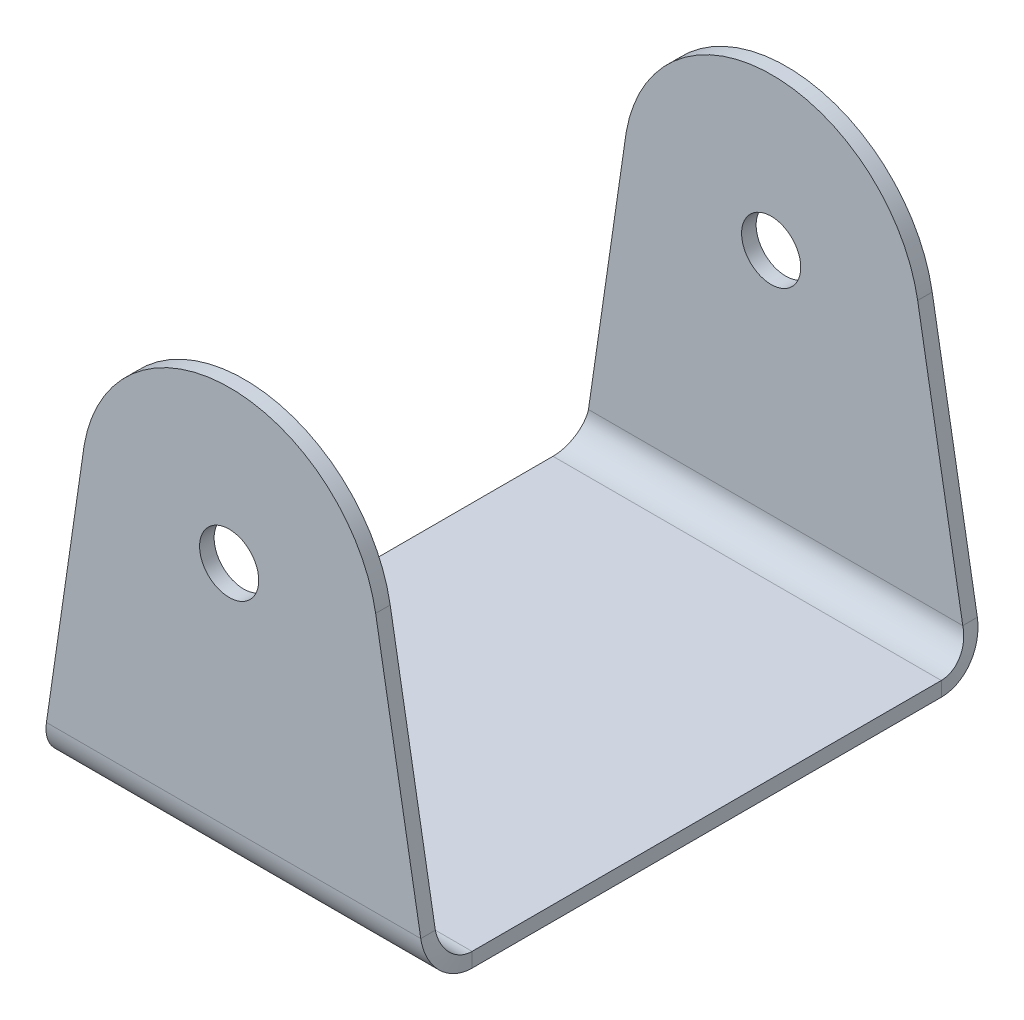
ISO-10303-21;
HEADER;
FILE_DESCRIPTION(('STEP AP214'),'2;1');
FILE_NAME('part.step','',(''),(''),'','','');
FILE_SCHEMA(('AUTOMOTIVE_DESIGN { 1 0 10303 214 1 1 1 1 }'));
ENDSEC;
DATA;
#1=APPLICATION_CONTEXT('core data for automotive mechanical design processes');
#2=APPLICATION_PROTOCOL_DEFINITION('international standard','automotive_design',2000,#1);
#3=PRODUCT_CONTEXT('',#1,'mechanical');
#4=PRODUCT('Part','Part','',(#3));
#5=PRODUCT_RELATED_PRODUCT_CATEGORY('part','',(#4));
#6=PRODUCT_DEFINITION_FORMATION('','',#4);
#7=PRODUCT_DEFINITION_CONTEXT('part definition',#1,'design');
#8=PRODUCT_DEFINITION('design','',#6,#7);
#9=PRODUCT_DEFINITION_SHAPE('','',#8);
#10=(LENGTH_UNIT() NAMED_UNIT(*) SI_UNIT(.MILLI.,.METRE.));
#11=(NAMED_UNIT(*) PLANE_ANGLE_UNIT() SI_UNIT($,.RADIAN.));
#12=(NAMED_UNIT(*) SI_UNIT($,.STERADIAN.) SOLID_ANGLE_UNIT());
#13=UNCERTAINTY_MEASURE_WITH_UNIT(LENGTH_MEASURE(1.E-05),#10,'distance_accuracy_value','');
#14=(GEOMETRIC_REPRESENTATION_CONTEXT(3) GLOBAL_UNCERTAINTY_ASSIGNED_CONTEXT((#13)) GLOBAL_UNIT_ASSIGNED_CONTEXT((#10,
#11,#12)) REPRESENTATION_CONTEXT('',''));
#15=CARTESIAN_POINT('',(0.,0.,0.));
#16=DIRECTION('',(0.,0.,1.));
#17=DIRECTION('',(1.,0.,0.));
#18=AXIS2_PLACEMENT_3D('',#15,#16,#17);
#19=CARTESIAN_POINT('',(-5.58999630794941,-5.51631765649433,43.961050169087));
#20=DIRECTION('',(1.,0.,0.));
#21=DIRECTION('',(0.,0.,-1.));
#22=AXIS2_PLACEMENT_3D('',#19,#20,#21);
#23=PLANE('',#22);
#24=DIRECTION('',(0.,-1.,0.));
#25=VECTOR('',#24,1.);
#26=CARTESIAN_POINT('',(-5.58999630794941,-5.51631765649433,-1.83404974771298));
#27=LINE('',#26,#25);
#28=CARTESIAN_POINT('',(-5.58999630794941,-4.21631765649433,-1.83404974771298));
#29=VERTEX_POINT('',#28);
#30=CARTESIAN_POINT('',(-5.58999630794941,-5.51631765649433,-1.83404974771298));
#31=VERTEX_POINT('',#30);
#32=EDGE_CURVE('E11',#29,#31,#27,.T.);
#33=ORIENTED_EDGE('',*,*,#32,.F.);
#34=DIRECTION('',(0.,0.,1.));
#35=VECTOR('',#34,1.);
#36=CARTESIAN_POINT('',(-5.58999630794941,-4.21631765649433,43.961050169087));
#37=LINE('',#36,#35);
#38=CARTESIAN_POINT('',(-5.58999630794941,-4.21631765649433,40.061050085887));
#39=VERTEX_POINT('',#38);
#40=EDGE_CURVE('E98',#39,#29,#37,.F.);
#41=ORIENTED_EDGE('',*,*,#40,.F.);
#42=DIRECTION('',(0.,-1.,0.));
#43=VECTOR('',#42,1.);
#44=CARTESIAN_POINT('',(-5.58999630794941,-5.51631765649433,40.061050085887));
#45=LINE('',#44,#43);
#46=CARTESIAN_POINT('',(-5.58999630794941,-5.51631765649433,40.061050085887));
#47=VERTEX_POINT('',#46);
#48=EDGE_CURVE('E51',#39,#47,#45,.T.);
#49=ORIENTED_EDGE('',*,*,#48,.T.);
#50=DIRECTION('',(0.,0.,-1.));
#51=VECTOR('',#50,1.);
#52=CARTESIAN_POINT('',(-5.58999630794941,-5.51631765649433,43.961050169087));
#53=LINE('',#52,#51);
#54=EDGE_CURVE('E100',#47,#31,#53,.T.);
#55=ORIENTED_EDGE('',*,*,#54,.T.);
#56=EDGE_LOOP('',(#33,#41,#49,#55));
#57=FACE_BOUND('',#56,.T.);
#58=ADVANCED_FACE('F41',(#57),#23,.T.);
#59=CARTESIAN_POINT('',(-6.94865199387656,0.983682509905666,40.061050085887));
#60=CARTESIAN_POINT('',(-6.94865199387656,1.417015843239,40.061050085887));
#61=CARTESIAN_POINT('',(-6.94865199387656,1.85034917657233,40.061050085887));
#62=CARTESIAN_POINT('',(-6.94865199387656,2.28368250990567,40.061050085887));
#63=CARTESIAN_POINT('',(-6.94865199387656,0.983682509905666,34.861049919487));
#64=CARTESIAN_POINT('',(-6.94865199387657,1.417015843239,33.9943832528204));
#65=CARTESIAN_POINT('',(-6.94865199387657,1.85034917657233,33.1277165861537));
#66=CARTESIAN_POINT('',(-6.94865199387656,2.28368250990567,32.261049919487));
#67=CARTESIAN_POINT('',(-5.58999630794941,-4.21631765649433,34.861049919487));
#68=CARTESIAN_POINT('',(-5.58999630794942,-4.64965098982767,33.9943832528204));
#69=CARTESIAN_POINT('',(-5.58999630794942,-5.082984323161,33.1277165861537));
#70=CARTESIAN_POINT('',(-5.58999630794941,-5.51631765649433,32.261049919487));
#71=CARTESIAN_POINT('',(-5.58999630794941,-4.21631765649433,40.061050085887));
#72=CARTESIAN_POINT('',(-5.58999630794941,-4.64965098982767,40.061050085887));
#73=CARTESIAN_POINT('',(-5.58999630794941,-5.082984323161,40.061050085887));
#74=CARTESIAN_POINT('',(-5.58999630794941,-5.51631765649433,40.061050085887));
#75=CARTESIAN_POINT('',(-5.58999630794941,-4.21631765649433,45.261050252287));
#76=CARTESIAN_POINT('',(-5.58999630794942,-4.64965098982767,46.1277169189537));
#77=CARTESIAN_POINT('',(-5.58999630794942,-5.082984323161,46.9943835856204));
#78=CARTESIAN_POINT('',(-5.58999630794941,-5.51631765649433,47.861050252287));
#79=CARTESIAN_POINT('',(-6.94865199387656,0.983682509905666,45.261050252287));
#80=CARTESIAN_POINT('',(-6.94865199387657,1.417015843239,46.1277169189537));
#81=CARTESIAN_POINT('',(-6.94865199387657,1.85034917657233,46.9943835856204));
#82=CARTESIAN_POINT('',(-6.94865199387656,2.28368250990567,47.861050252287));
#83=CARTESIAN_POINT('',(-6.94865199387656,0.983682509905666,40.061050085887));
#84=CARTESIAN_POINT('',(-6.94865199387656,1.417015843239,40.061050085887));
#85=CARTESIAN_POINT('',(-6.94865199387656,1.85034917657233,40.061050085887));
#86=CARTESIAN_POINT('',(-6.94865199387656,2.28368250990567,40.061050085887));
#87=(BOUNDED_SURFACE() B_SPLINE_SURFACE(3,3,((#59,#60,#61,#62),(#63,#64,#65,#66),(#67,#68,#69,
#70),(#71,#72,#73,#74),(#75,#76,#77,#78),(#79,#80,#81,#82),(#83,#84,#85,#86)),.UNSPECIFIED.,.T.,
.F.,.F.) B_SPLINE_SURFACE_WITH_KNOTS((4,3,4),(4,4),(0.,0.5,1.),(0.,1.),
.UNSPECIFIED.) GEOMETRIC_REPRESENTATION_ITEM() RATIONAL_B_SPLINE_SURFACE(((1.,1.,1.,1.),
(0.333333333333333,0.333333333333333,0.333333333333333,0.333333333333333),(0.333333333333333,
0.333333333333333,0.333333333333333,0.333333333333333),(1.,1.,1.,1.),(0.333333333333333,
0.333333333333333,0.333333333333333,0.333333333333333),(0.333333333333333,0.333333333333333,
0.333333333333333,0.333333333333333),(1.,1.,1.,1.))) REPRESENTATION_ITEM('') SURFACE());
#88=CARTESIAN_POINT('',(-6.26932415091299,-1.61631757329433,40.061050085887));
#89=DIRECTION('',(-0.967520225476182,-0.25279361798613,0.));
#90=DIRECTION('',(-0.25279361798613,0.967520225476182,0.));
#91=AXIS2_PLACEMENT_3D('',#88,#89,#90);
#92=ELLIPSE('',#91,2.68728240995723,2.6000000832);
#93=CARTESIAN_POINT('',(-6.26932415091299,-1.61631757329433,42.661050169087));
#94=VERTEX_POINT('',#93);
#95=EDGE_CURVE('E140',#39,#94,#92,.T.);
#96=DIRECTION('',(0.,0.,1.));
#97=VECTOR('',#96,1.);
#98=CARTESIAN_POINT('',(-6.26932415091299,-1.61631757329433,43.961050169087));
#99=LINE('',#98,#97);
#100=CARTESIAN_POINT('',(-6.26932415091299,-1.61631757329433,43.961050169087));
#101=VERTEX_POINT('',#100);
#102=EDGE_CURVE('E170',#94,#101,#99,.T.);
#103=CARTESIAN_POINT('',(-6.26932415091299,-1.61631757329433,40.061050085887));
#104=DIRECTION('',(-0.985166222964665,-0.171602777161489,0.));
#105=DIRECTION('',(-0.171602777161489,0.985166222964665,0.));
#106=AXIS2_PLACEMENT_3D('',#103,#104,#105);
#107=ELLIPSE('',#106,3.9587228959837,3.9000000832);
#108=EDGE_CURVE('E178',#47,#101,#107,.T.);
#109=ORIENTED_EDGE('',*,*,#48,.F.);
#110=ORIENTED_EDGE('',*,*,#95,.T.);
#111=ORIENTED_EDGE('',*,*,#102,.T.);
#112=ORIENTED_EDGE('',*,*,#108,.F.);
#113=EDGE_LOOP('',(#109,#110,#111,#112));
#114=FACE_BOUND('',#113,.T.);
#115=ADVANCED_FACE('F177',(#114),#87,.T.);
#116=CARTESIAN_POINT('',(-5.58999630794941,-5.51631765649433,43.961050169087));
#117=DIRECTION('',(0.985166222964665,0.171602777161489,0.));
#118=DIRECTION('',(-0.171602777161489,0.985166222964665,0.));
#119=AXIS2_PLACEMENT_3D('',#116,#117,#118);
#120=PLANE('',#119);
#121=ORIENTED_EDGE('',*,*,#102,.F.);
#122=DIRECTION('',(-0.171602777161489,0.985166222964665,0.));
#123=VECTOR('',#122,1.);
#124=CARTESIAN_POINT('',(-5.58999630794941,-5.51631765649433,42.661050169087));
#125=LINE('',#124,#123);
#126=CARTESIAN_POINT('',(-10.2985277811944,21.5152155385759,42.661050169087));
#127=VERTEX_POINT('',#126);
#128=EDGE_CURVE('E238',#94,#127,#125,.T.);
#129=ORIENTED_EDGE('',*,*,#128,.T.);
#130=DIRECTION('',(0.,0.,1.));
#131=VECTOR('',#130,1.);
#132=CARTESIAN_POINT('',(-10.2985277811944,21.5152155385759,43.961050169087));
#133=LINE('',#132,#131);
#134=CARTESIAN_POINT('',(-10.2985277811944,21.5152155385759,43.961050169087));
#135=VERTEX_POINT('',#134);
#136=EDGE_CURVE('E167',#127,#135,#133,.T.);
#137=ORIENTED_EDGE('',*,*,#136,.T.);
#138=DIRECTION('',(-0.171602777161489,0.985166222964665,0.));
#139=VECTOR('',#138,1.);
#140=CARTESIAN_POINT('',(-5.58999630794941,-5.51631765649433,43.961050169087));
#141=LINE('',#140,#139);
#142=EDGE_CURVE('E196',#101,#135,#141,.T.);
#143=ORIENTED_EDGE('',*,*,#142,.F.);
#144=EDGE_LOOP('',(#121,#129,#137,#143));
#145=FACE_BOUND('',#144,.T.);
#146=ADVANCED_FACE('F197',(#145),#120,.T.);
#147=CARTESIAN_POINT('',(-23.3106032541117,19.2486860578269,43.961050169087));
#148=DIRECTION('',(0.,0.,1.));
#149=DIRECTION('',(1.,0.,0.));
#150=AXIS2_PLACEMENT_3D('',#147,#148,#149);
#151=CYLINDRICAL_SURFACE('',#150,13.208);
#152=ORIENTED_EDGE('',*,*,#136,.F.);
#153=CARTESIAN_POINT('',(-23.3106032541117,19.2486860578269,42.661050169087));
#154=DIRECTION('',(0.,0.,1.));
#155=DIRECTION('',(1.,0.,0.));
#156=AXIS2_PLACEMENT_3D('',#153,#154,#155);
#157=CIRCLE('',#156,13.208);
#158=CARTESIAN_POINT('',(-36.3260636869663,21.4956960090278,42.661050169087));
#159=VERTEX_POINT('',#158);
#160=EDGE_CURVE('E129',#127,#159,#157,.T.);
#161=ORIENTED_EDGE('',*,*,#160,.T.);
#162=DIRECTION('',(0.,0.,1.));
#163=VECTOR('',#162,1.);
#164=CARTESIAN_POINT('',(-36.3260636869664,21.4956960090277,43.961050169087));
#165=LINE('',#164,#163);
#166=CARTESIAN_POINT('',(-36.3260636869664,21.4956960090277,43.961050169087));
#167=VERTEX_POINT('',#166);
#168=EDGE_CURVE('E164',#159,#167,#165,.T.);
#169=ORIENTED_EDGE('',*,*,#168,.T.);
#170=CARTESIAN_POINT('',(-23.3106032541117,19.2486860578269,43.961050169087));
#171=DIRECTION('',(0.,0.,1.));
#172=DIRECTION('',(1.,0.,0.));
#173=AXIS2_PLACEMENT_3D('',#170,#171,#172);
#174=CIRCLE('',#173,13.208);
#175=EDGE_CURVE('E201',#135,#167,#174,.T.);
#176=ORIENTED_EDGE('',*,*,#175,.F.);
#177=EDGE_LOOP('',(#152,#161,#169,#176));
#178=FACE_BOUND('',#177,.T.);
#179=ADVANCED_FACE('F249',(#178),#151,.T.);
#180=CARTESIAN_POINT('',(-36.3260636869664,21.4956960090277,43.961050169087));
#181=DIRECTION('',(-0.989555564392376,0.144151951010336,0.));
#182=DIRECTION('',(-0.144151951010336,-0.989555564392376,0.));
#183=AXIS2_PLACEMENT_3D('',#180,#181,#182);
#184=PLANE('',#183);
#185=ORIENTED_EDGE('',*,*,#168,.F.);
#186=DIRECTION('',(-0.144151951010336,-0.989555564392376,0.));
#187=VECTOR('',#186,1.);
#188=CARTESIAN_POINT('',(-36.3260636869664,21.4956960090277,42.661050169087));
#189=LINE('',#188,#187);
#190=CARTESIAN_POINT('',(-39.6928699276193,-1.61631757329433,42.661050169087));
#191=VERTEX_POINT('',#190);
#192=EDGE_CURVE('E146',#159,#191,#189,.T.);
#193=ORIENTED_EDGE('',*,*,#192,.T.);
#194=DIRECTION('',(0.,0.,1.));
#195=VECTOR('',#194,1.);
#196=CARTESIAN_POINT('',(-39.6928699276193,-1.61631757329433,43.961050169087));
#197=LINE('',#196,#195);
#198=CARTESIAN_POINT('',(-39.6928699276193,-1.61631757329433,43.961050169087));
#199=VERTEX_POINT('',#198);
#200=EDGE_CURVE('E161',#191,#199,#197,.T.);
#201=ORIENTED_EDGE('',*,*,#200,.T.);
#202=DIRECTION('',(-0.144151951010336,-0.989555564392376,0.));
#203=VECTOR('',#202,1.);
#204=CARTESIAN_POINT('',(-36.3260636869664,21.4956960090277,43.961050169087));
#205=LINE('',#204,#203);
#206=EDGE_CURVE('E202',#167,#199,#205,.T.);
#207=ORIENTED_EDGE('',*,*,#206,.F.);
#208=EDGE_LOOP('',(#185,#193,#201,#207));
#209=FACE_BOUND('',#208,.T.);
#210=ADVANCED_FACE('F363',(#209),#184,.T.);
#211=CARTESIAN_POINT('',(-40.2609963079494,-5.51631765649433,40.061050085887));
#212=CARTESIAN_POINT('',(-40.2609963079494,-5.082984323161,40.061050085887));
#213=CARTESIAN_POINT('',(-40.2609963079494,-4.64965098982767,40.061050085887));
#214=CARTESIAN_POINT('',(-40.2609963079494,-4.21631765649433,40.061050085887));
#215=CARTESIAN_POINT('',(-40.2609963079494,-5.51631765649433,32.261049919487));
#216=CARTESIAN_POINT('',(-40.2609963079494,-5.082984323161,33.1277165861537));
#217=CARTESIAN_POINT('',(-40.2609963079494,-4.64965098982767,33.9943832528204));
#218=CARTESIAN_POINT('',(-40.2609963079494,-4.21631765649433,34.861049919487));
#219=CARTESIAN_POINT('',(-39.1247435472892,2.28368250990567,32.261049919487));
#220=CARTESIAN_POINT('',(-39.1247435472892,1.85034917657233,33.1277165861537));
#221=CARTESIAN_POINT('',(-39.1247435472892,1.417015843239,33.9943832528204));
#222=CARTESIAN_POINT('',(-39.1247435472892,0.983682509905666,34.861049919487));
#223=CARTESIAN_POINT('',(-39.1247435472892,2.28368250990567,40.061050085887));
#224=CARTESIAN_POINT('',(-39.1247435472892,1.85034917657233,40.061050085887));
#225=CARTESIAN_POINT('',(-39.1247435472892,1.417015843239,40.061050085887));
#226=CARTESIAN_POINT('',(-39.1247435472892,0.983682509905666,40.061050085887));
#227=CARTESIAN_POINT('',(-39.1247435472892,2.28368250990566,47.861050252287));
#228=CARTESIAN_POINT('',(-39.1247435472892,1.85034917657233,46.9943835856204));
#229=CARTESIAN_POINT('',(-39.1247435472892,1.417015843239,46.1277169189537));
#230=CARTESIAN_POINT('',(-39.1247435472892,0.983682509905665,45.261050252287));
#231=CARTESIAN_POINT('',(-40.2609963079494,-5.51631765649433,47.861050252287));
#232=CARTESIAN_POINT('',(-40.2609963079494,-5.082984323161,46.9943835856204));
#233=CARTESIAN_POINT('',(-40.2609963079494,-4.64965098982767,46.1277169189537));
#234=CARTESIAN_POINT('',(-40.2609963079494,-4.21631765649433,45.261050252287));
#235=CARTESIAN_POINT('',(-40.2609963079494,-5.51631765649433,40.061050085887));
#236=CARTESIAN_POINT('',(-40.2609963079494,-5.082984323161,40.061050085887));
#237=CARTESIAN_POINT('',(-40.2609963079494,-4.64965098982767,40.061050085887));
#238=CARTESIAN_POINT('',(-40.2609963079494,-4.21631765649433,40.061050085887));
#239=(BOUNDED_SURFACE() B_SPLINE_SURFACE(3,3,((#211,#212,#213,#214),(#215,#216,#217,#218),(#219,
#220,#221,#222),(#223,#224,#225,#226),(#227,#228,#229,#230),(#231,#232,#233,#234),(#235,#236,
#237,#238)),.UNSPECIFIED.,.T.,.F.,.F.) B_SPLINE_SURFACE_WITH_KNOTS((4,3,4),(4,4),(0.,0.5,1.),
(0.,1.),.UNSPECIFIED.) GEOMETRIC_REPRESENTATION_ITEM() RATIONAL_B_SPLINE_SURFACE(((1.,1.,1.,1.),
(0.333333333333333,0.333333333333333,0.333333333333333,0.333333333333333),(0.333333333333333,
0.333333333333333,0.333333333333333,0.333333333333333),(1.,1.,1.,1.),(0.333333333333333,
0.333333333333333,0.333333333333333,0.333333333333333),(0.333333333333333,0.333333333333333,
0.333333333333333,0.333333333333333),(1.,1.,1.,1.))) REPRESENTATION_ITEM('') SURFACE());
#240=CARTESIAN_POINT('',(-39.6928699276193,-1.61631757329433,40.061050085887));
#241=DIRECTION('',(-0.976948910990753,0.213473242618322,0.));
#242=DIRECTION('',(-0.213473242618322,-0.976948910990753,0.));
#243=AXIS2_PLACEMENT_3D('',#240,#241,#242);
#244=ELLIPSE('',#243,2.66134703048419,2.6000000832);
#245=CARTESIAN_POINT('',(-40.2609963079494,-4.21631765649433,40.061050085887));
#246=VERTEX_POINT('',#245);
#247=EDGE_CURVE('E135',#191,#246,#244,.F.);
#248=DIRECTION('',(0.,-1.,0.));
#249=VECTOR('',#248,1.);
#250=CARTESIAN_POINT('',(-40.2609963079494,-5.51631765649433,40.061050085887));
#251=LINE('',#250,#249);
#252=CARTESIAN_POINT('',(-40.2609963079494,-5.51631765649433,40.061050085887));
#253=VERTEX_POINT('',#252);
#254=EDGE_CURVE('E159',#246,#253,#251,.T.);
#255=CARTESIAN_POINT('',(-39.6928699276193,-1.61631757329433,40.061050085887));
#256=DIRECTION('',(-0.989555564392376,0.144151951010336,0.));
#257=DIRECTION('',(-0.144151951010336,-0.989555564392376,0.));
#258=AXIS2_PLACEMENT_3D('',#255,#256,#257);
#259=ELLIPSE('',#258,3.94116330960631,3.9000000832);
#260=EDGE_CURVE('E193',#199,#253,#259,.F.);
#261=ORIENTED_EDGE('',*,*,#200,.F.);
#262=ORIENTED_EDGE('',*,*,#247,.T.);
#263=ORIENTED_EDGE('',*,*,#254,.T.);
#264=ORIENTED_EDGE('',*,*,#260,.F.);
#265=EDGE_LOOP('',(#261,#262,#263,#264));
#266=FACE_BOUND('',#265,.T.);
#267=ADVANCED_FACE('F357',(#266),#239,.F.);
#268=CARTESIAN_POINT('',(-40.2609963079494,-5.51631765649433,43.961050169087));
#269=DIRECTION('',(1.,0.,0.));
#270=DIRECTION('',(0.,0.,-1.));
#271=AXIS2_PLACEMENT_3D('',#268,#269,#270);
#272=PLANE('',#271);
#273=ORIENTED_EDGE('',*,*,#254,.F.);
#274=DIRECTION('',(0.,0.,1.));
#275=VECTOR('',#274,1.);
#276=CARTESIAN_POINT('',(-40.2609963079494,-4.21631765649433,43.961050169087));
#277=LINE('',#276,#275);
#278=CARTESIAN_POINT('',(-40.2609963079494,-4.21631765649433,-1.83404974771298));
#279=VERTEX_POINT('',#278);
#280=EDGE_CURVE('E128',#246,#279,#277,.F.);
#281=ORIENTED_EDGE('',*,*,#280,.T.);
#282=DIRECTION('',(0.,-1.,0.));
#283=VECTOR('',#282,1.);
#284=CARTESIAN_POINT('',(-40.2609963079494,-5.51631765649433,-1.83404974771298));
#285=LINE('',#284,#283);
#286=CARTESIAN_POINT('',(-40.2609963079494,-5.51631765649433,-1.83404974771298));
#287=VERTEX_POINT('',#286);
#288=EDGE_CURVE('E156',#279,#287,#285,.T.);
#289=ORIENTED_EDGE('',*,*,#288,.T.);
#290=DIRECTION('',(0.,0.,-1.));
#291=VECTOR('',#290,1.);
#292=CARTESIAN_POINT('',(-40.2609963079494,-5.51631765649433,43.961050169087));
#293=LINE('',#292,#291);
#294=EDGE_CURVE('E253',#253,#287,#293,.T.);
#295=ORIENTED_EDGE('',*,*,#294,.F.);
#296=EDGE_LOOP('',(#273,#281,#289,#295));
#297=FACE_BOUND('',#296,.T.);
#298=ADVANCED_FACE('F348',(#297),#272,.F.);
#299=CARTESIAN_POINT('',(-39.1247435472892,0.983682509905667,-1.83404974771298));
#300=CARTESIAN_POINT('',(-39.1247435472892,1.417015843239,-1.83404974771298));
#301=CARTESIAN_POINT('',(-39.1247435472892,1.85034917657233,-1.83404974771298));
#302=CARTESIAN_POINT('',(-39.1247435472892,2.28368250990567,-1.83404974771298));
#303=CARTESIAN_POINT('',(-39.1247435472892,0.983682509905667,3.36595041868702));
#304=CARTESIAN_POINT('',(-39.1247435472892,1.417015843239,4.23261708535369));
#305=CARTESIAN_POINT('',(-39.1247435472892,1.85034917657233,5.09928375202035));
#306=CARTESIAN_POINT('',(-39.1247435472892,2.28368250990567,5.96595041868701));
#307=CARTESIAN_POINT('',(-40.2609963079494,-4.21631765649433,3.36595041868702));
#308=CARTESIAN_POINT('',(-40.2609963079494,-4.64965098982767,4.23261708535369));
#309=CARTESIAN_POINT('',(-40.2609963079494,-5.082984323161,5.09928375202035));
#310=CARTESIAN_POINT('',(-40.2609963079494,-5.51631765649433,5.96595041868702));
#311=CARTESIAN_POINT('',(-40.2609963079494,-4.21631765649433,-1.83404974771298));
#312=CARTESIAN_POINT('',(-40.2609963079494,-4.64965098982767,-1.83404974771298));
#313=CARTESIAN_POINT('',(-40.2609963079494,-5.082984323161,-1.83404974771298));
#314=CARTESIAN_POINT('',(-40.2609963079494,-5.51631765649433,-1.83404974771298));
#315=CARTESIAN_POINT('',(-40.2609963079494,-4.21631765649433,-7.03404991411298));
#316=CARTESIAN_POINT('',(-40.2609963079494,-4.64965098982767,-7.90071658077965));
#317=CARTESIAN_POINT('',(-40.2609963079494,-5.082984323161,-8.76738324744632));
#318=CARTESIAN_POINT('',(-40.2609963079494,-5.51631765649433,-9.63404991411298));
#319=CARTESIAN_POINT('',(-39.1247435472892,0.983682509905667,-7.03404991411298));
#320=CARTESIAN_POINT('',(-39.1247435472892,1.417015843239,-7.90071658077965));
#321=CARTESIAN_POINT('',(-39.1247435472892,1.85034917657233,-8.76738324744632));
#322=CARTESIAN_POINT('',(-39.1247435472892,2.28368250990567,-9.63404991411298));
#323=CARTESIAN_POINT('',(-39.1247435472892,0.983682509905667,-1.83404974771298));
#324=CARTESIAN_POINT('',(-39.1247435472892,1.417015843239,-1.83404974771298));
#325=CARTESIAN_POINT('',(-39.1247435472892,1.85034917657233,-1.83404974771298));
#326=CARTESIAN_POINT('',(-39.1247435472892,2.28368250990567,-1.83404974771298));
#327=(BOUNDED_SURFACE() B_SPLINE_SURFACE(3,3,((#299,#300,#301,#302),(#303,#304,#305,#306),(#307,
#308,#309,#310),(#311,#312,#313,#314),(#315,#316,#317,#318),(#319,#320,#321,#322),(#323,#324,
#325,#326)),.UNSPECIFIED.,.T.,.F.,.F.) B_SPLINE_SURFACE_WITH_KNOTS((4,3,4),(4,4),(0.,0.5,1.),
(0.,1.),.UNSPECIFIED.) GEOMETRIC_REPRESENTATION_ITEM() RATIONAL_B_SPLINE_SURFACE(((1.,1.,1.,1.),
(0.333333333333333,0.333333333333333,0.333333333333333,0.333333333333333),(0.333333333333333,
0.333333333333333,0.333333333333333,0.333333333333333),(1.,1.,1.,1.),(0.333333333333333,
0.333333333333333,0.333333333333333,0.333333333333333),(0.333333333333333,0.333333333333333,
0.333333333333333,0.333333333333333),(1.,1.,1.,1.))) REPRESENTATION_ITEM('') SURFACE());
#328=CARTESIAN_POINT('',(-39.6928699276193,-1.61631757329433,-1.83404974771298));
#329=DIRECTION('',(0.976948910990753,-0.213473242618322,0.));
#330=DIRECTION('',(0.213473242618322,0.976948910990753,0.));
#331=AXIS2_PLACEMENT_3D('',#328,#329,#330);
#332=ELLIPSE('',#331,2.66134703048419,2.6000000832);
#333=CARTESIAN_POINT('',(-39.6928699276193,-1.61631757329433,-4.43404983091298));
#334=VERTEX_POINT('',#333);
#335=EDGE_CURVE('E116',#279,#334,#332,.T.);
#336=DIRECTION('',(0.,0.,-1.));
#337=VECTOR('',#336,1.);
#338=CARTESIAN_POINT('',(-39.6928699276193,-1.61631757329433,-5.73404983091299));
#339=LINE('',#338,#337);
#340=CARTESIAN_POINT('',(-39.6928699276193,-1.61631757329433,-5.73404983091299));
#341=VERTEX_POINT('',#340);
#342=EDGE_CURVE('E153',#334,#341,#339,.T.);
#343=CARTESIAN_POINT('',(-39.6928699276193,-1.61631757329433,-1.83404974771298));
#344=DIRECTION('',(0.989555564392376,-0.144151951010336,0.));
#345=DIRECTION('',(0.144151951010336,0.989555564392376,0.));
#346=AXIS2_PLACEMENT_3D('',#343,#344,#345);
#347=ELLIPSE('',#346,3.94116330960631,3.9000000832);
#348=EDGE_CURVE('E215',#287,#341,#347,.T.);
#349=ORIENTED_EDGE('',*,*,#288,.F.);
#350=ORIENTED_EDGE('',*,*,#335,.T.);
#351=ORIENTED_EDGE('',*,*,#342,.T.);
#352=ORIENTED_EDGE('',*,*,#348,.F.);
#353=EDGE_LOOP('',(#349,#350,#351,#352));
#354=FACE_BOUND('',#353,.T.);
#355=ADVANCED_FACE('F342',(#354),#327,.T.);
#356=CARTESIAN_POINT('',(-36.3260636869664,21.4956960090277,-5.73404983091299));
#357=DIRECTION('',(-0.989555564392376,0.144151951010336,0.));
#358=DIRECTION('',(-0.144151951010336,-0.989555564392376,0.));
#359=AXIS2_PLACEMENT_3D('',#356,#357,#358);
#360=PLANE('',#359);
#361=ORIENTED_EDGE('',*,*,#342,.F.);
#362=DIRECTION('',(-0.144151951010336,-0.989555564392376,0.));
#363=VECTOR('',#362,1.);
#364=CARTESIAN_POINT('',(-36.3260636869664,21.4956960090277,-4.43404983091299));
#365=LINE('',#364,#363);
#366=CARTESIAN_POINT('',(-36.3260636869663,21.4956960090278,-4.43404983091299));
#367=VERTEX_POINT('',#366);
#368=EDGE_CURVE('E227',#367,#334,#365,.T.);
#369=ORIENTED_EDGE('',*,*,#368,.F.);
#370=DIRECTION('',(0.,0.,-1.));
#371=VECTOR('',#370,1.);
#372=CARTESIAN_POINT('',(-36.3260636869664,21.4956960090277,-5.73404983091299));
#373=LINE('',#372,#371);
#374=CARTESIAN_POINT('',(-36.3260636869664,21.4956960090277,-5.73404983091299));
#375=VERTEX_POINT('',#374);
#376=EDGE_CURVE('E150',#367,#375,#373,.T.);
#377=ORIENTED_EDGE('',*,*,#376,.T.);
#378=DIRECTION('',(-0.144151951010336,-0.989555564392376,0.));
#379=VECTOR('',#378,1.);
#380=CARTESIAN_POINT('',(-36.3260636869664,21.4956960090277,-5.73404983091299));
#381=LINE('',#380,#379);
#382=EDGE_CURVE('E262',#375,#341,#381,.T.);
#383=ORIENTED_EDGE('',*,*,#382,.T.);
#384=EDGE_LOOP('',(#361,#369,#377,#383));
#385=FACE_BOUND('',#384,.T.);
#386=ADVANCED_FACE('F338',(#385),#360,.T.);
#387=CARTESIAN_POINT('',(-23.3106032541117,19.2486860578269,-5.73404983091299));
#388=DIRECTION('',(0.,0.,1.));
#389=DIRECTION('',(1.,0.,0.));
#390=AXIS2_PLACEMENT_3D('',#387,#388,#389);
#391=CYLINDRICAL_SURFACE('',#390,13.208);
#392=ORIENTED_EDGE('',*,*,#376,.F.);
#393=CARTESIAN_POINT('',(-23.3106032541117,19.2486860578269,-4.43404983091299));
#394=DIRECTION('',(0.,0.,1.));
#395=DIRECTION('',(1.,0.,0.));
#396=AXIS2_PLACEMENT_3D('',#393,#394,#395);
#397=CIRCLE('',#396,13.208);
#398=CARTESIAN_POINT('',(-10.2985277811944,21.5152155385759,-4.43404983091299));
#399=VERTEX_POINT('',#398);
#400=EDGE_CURVE('E230',#399,#367,#397,.T.);
#401=ORIENTED_EDGE('',*,*,#400,.F.);
#402=DIRECTION('',(0.,0.,-1.));
#403=VECTOR('',#402,1.);
#404=CARTESIAN_POINT('',(-10.2985277811944,21.5152155385759,-5.73404983091299));
#405=LINE('',#404,#403);
#406=CARTESIAN_POINT('',(-10.2985277811944,21.5152155385759,-5.73404983091299));
#407=VERTEX_POINT('',#406);
#408=EDGE_CURVE('E147',#399,#407,#405,.T.);
#409=ORIENTED_EDGE('',*,*,#408,.T.);
#410=CARTESIAN_POINT('',(-23.3106032541117,19.2486860578269,-5.73404983091299));
#411=DIRECTION('',(0.,0.,1.));
#412=DIRECTION('',(1.,0.,0.));
#413=AXIS2_PLACEMENT_3D('',#410,#411,#412);
#414=CIRCLE('',#413,13.208);
#415=EDGE_CURVE('E265',#407,#375,#414,.T.);
#416=ORIENTED_EDGE('',*,*,#415,.T.);
#417=EDGE_LOOP('',(#392,#401,#409,#416));
#418=FACE_BOUND('',#417,.T.);
#419=ADVANCED_FACE('F334',(#418),#391,.T.);
#420=CARTESIAN_POINT('',(-5.58999630794941,-5.51631765649433,-5.73404983091299));
#421=DIRECTION('',(0.985166222964665,0.171602777161489,0.));
#422=DIRECTION('',(-0.171602777161489,0.985166222964665,0.));
#423=AXIS2_PLACEMENT_3D('',#420,#421,#422);
#424=PLANE('',#423);
#425=ORIENTED_EDGE('',*,*,#408,.F.);
#426=DIRECTION('',(-0.171602777161489,0.985166222964665,0.));
#427=VECTOR('',#426,1.);
#428=CARTESIAN_POINT('',(-5.58999630794941,-5.51631765649433,-4.43404983091299));
#429=LINE('',#428,#427);
#430=CARTESIAN_POINT('',(-6.26932415091299,-1.61631757329433,-4.43404983091299));
#431=VERTEX_POINT('',#430);
#432=EDGE_CURVE('E121',#431,#399,#429,.T.);
#433=ORIENTED_EDGE('',*,*,#432,.F.);
#434=DIRECTION('',(0.,0.,-1.));
#435=VECTOR('',#434,1.);
#436=CARTESIAN_POINT('',(-6.26932415091299,-1.61631757329433,-5.73404983091299));
#437=LINE('',#436,#435);
#438=CARTESIAN_POINT('',(-6.26932415091299,-1.61631757329433,-5.73404983091299));
#439=VERTEX_POINT('',#438);
#440=EDGE_CURVE('E45',#431,#439,#437,.T.);
#441=ORIENTED_EDGE('',*,*,#440,.T.);
#442=DIRECTION('',(-0.171602777161489,0.985166222964665,0.));
#443=VECTOR('',#442,1.);
#444=CARTESIAN_POINT('',(-5.58999630794941,-5.51631765649433,-5.73404983091299));
#445=LINE('',#444,#443);
#446=EDGE_CURVE('E268',#439,#407,#445,.T.);
#447=ORIENTED_EDGE('',*,*,#446,.T.);
#448=EDGE_LOOP('',(#425,#433,#441,#447));
#449=FACE_BOUND('',#448,.T.);
#450=ADVANCED_FACE('F325',(#449),#424,.T.);
#451=CARTESIAN_POINT('',(-23.3783250910446,18.8473943952813,43.961050169087));
#452=DIRECTION('',(0.,0.,1.));
#453=DIRECTION('',(1.,0.,0.));
#454=AXIS2_PLACEMENT_3D('',#451,#452,#453);
#455=CYLINDRICAL_SURFACE('',#454,2.6416);
#456=CARTESIAN_POINT('',(-23.3783250910446,18.8473943952813,43.961050169087));
#457=DIRECTION('',(0.,0.,1.));
#458=DIRECTION('',(1.,0.,0.));
#459=AXIS2_PLACEMENT_3D('',#456,#457,#458);
#460=CIRCLE('',#459,2.6416);
#461=CARTESIAN_POINT('',(-20.7367250910446,18.8473943952813,43.961050169087));
#462=VERTEX_POINT('',#461);
#463=EDGE_CURVE('E275',#462,#462,#460,.T.);
#464=ORIENTED_EDGE('',*,*,#463,.T.);
#465=EDGE_LOOP('',(#464));
#466=FACE_BOUND('',#465,.T.);
#467=CARTESIAN_POINT('',(-23.3783250910446,18.8473943952813,42.661050169087));
#468=DIRECTION('',(0.,0.,1.));
#469=DIRECTION('',(1.,0.,0.));
#470=AXIS2_PLACEMENT_3D('',#467,#468,#469);
#471=CIRCLE('',#470,2.6416);
#472=CARTESIAN_POINT('',(-20.7367250910446,18.8473943952813,42.661050169087));
#473=VERTEX_POINT('',#472);
#474=EDGE_CURVE('E137',#473,#473,#471,.T.);
#475=ORIENTED_EDGE('',*,*,#474,.F.);
#476=EDGE_LOOP('',(#475));
#477=FACE_BOUND('',#476,.T.);
#478=ADVANCED_FACE('F43',(#466,#477),#455,.F.);
#479=CARTESIAN_POINT('',(-23.3783250910446,18.8473943952813,-5.73404983091299));
#480=DIRECTION('',(0.,0.,1.));
#481=DIRECTION('',(1.,0.,0.));
#482=AXIS2_PLACEMENT_3D('',#479,#480,#481);
#483=CYLINDRICAL_SURFACE('',#482,2.6416);
#484=CARTESIAN_POINT('',(-23.3783250910446,18.8473943952813,-5.73404983091299));
#485=DIRECTION('',(0.,0.,1.));
#486=DIRECTION('',(1.,0.,0.));
#487=AXIS2_PLACEMENT_3D('',#484,#485,#486);
#488=CIRCLE('',#487,2.6416);
#489=CARTESIAN_POINT('',(-20.7367250910446,18.8473943952813,-5.73404983091299));
#490=VERTEX_POINT('',#489);
#491=EDGE_CURVE('E259',#490,#490,#488,.T.);
#492=ORIENTED_EDGE('',*,*,#491,.F.);
#493=EDGE_LOOP('',(#492));
#494=FACE_BOUND('',#493,.T.);
#495=CARTESIAN_POINT('',(-23.3783250910446,18.8473943952813,-4.43404983091299));
#496=DIRECTION('',(0.,0.,1.));
#497=DIRECTION('',(1.,0.,0.));
#498=AXIS2_PLACEMENT_3D('',#495,#496,#497);
#499=CIRCLE('',#498,2.6416);
#500=CARTESIAN_POINT('',(-20.7367250910446,18.8473943952813,-4.43404983091299));
#501=VERTEX_POINT('',#500);
#502=EDGE_CURVE('E224',#501,#501,#499,.T.);
#503=ORIENTED_EDGE('',*,*,#502,.T.);
#504=EDGE_LOOP('',(#503));
#505=FACE_BOUND('',#504,.T.);
#506=ADVANCED_FACE('F308',(#494,#505),#483,.F.);
#507=CARTESIAN_POINT('',(-5.58999630794941,-5.51631765649433,-1.83404974771298));
#508=CARTESIAN_POINT('',(-5.58999630794941,-5.082984323161,-1.83404974771298));
#509=CARTESIAN_POINT('',(-5.58999630794941,-4.64965098982767,-1.83404974771298));
#510=CARTESIAN_POINT('',(-5.58999630794941,-4.21631765649433,-1.83404974771298));
#511=CARTESIAN_POINT('',(-5.58999630794941,-5.51631765649433,5.96595041868701));
#512=CARTESIAN_POINT('',(-5.58999630794942,-5.082984323161,5.09928375202035));
#513=CARTESIAN_POINT('',(-5.58999630794942,-4.64965098982767,4.23261708535368));
#514=CARTESIAN_POINT('',(-5.58999630794941,-4.21631765649433,3.36595041868701));
#515=CARTESIAN_POINT('',(-6.94865199387656,2.28368250990567,5.96595041868701));
#516=CARTESIAN_POINT('',(-6.94865199387657,1.85034917657234,5.09928375202035));
#517=CARTESIAN_POINT('',(-6.94865199387657,1.417015843239,4.23261708535368));
#518=CARTESIAN_POINT('',(-6.94865199387656,0.983682509905667,3.36595041868701));
#519=CARTESIAN_POINT('',(-6.94865199387656,2.28368250990567,-1.83404974771298));
#520=CARTESIAN_POINT('',(-6.94865199387656,1.85034917657233,-1.83404974771298));
#521=CARTESIAN_POINT('',(-6.94865199387656,1.417015843239,-1.83404974771298));
#522=CARTESIAN_POINT('',(-6.94865199387656,0.983682509905667,-1.83404974771298));
#523=CARTESIAN_POINT('',(-6.94865199387656,2.28368250990567,-9.63404991411298));
#524=CARTESIAN_POINT('',(-6.94865199387657,1.85034917657233,-8.76738324744632));
#525=CARTESIAN_POINT('',(-6.94865199387657,1.417015843239,-7.90071658077965));
#526=CARTESIAN_POINT('',(-6.94865199387656,0.983682509905666,-7.03404991411298));
#527=CARTESIAN_POINT('',(-5.58999630794941,-5.51631765649433,-9.63404991411298));
#528=CARTESIAN_POINT('',(-5.58999630794942,-5.082984323161,-8.76738324744632));
#529=CARTESIAN_POINT('',(-5.58999630794942,-4.64965098982767,-7.90071658077965));
#530=CARTESIAN_POINT('',(-5.58999630794941,-4.21631765649433,-7.03404991411298));
#531=CARTESIAN_POINT('',(-5.58999630794941,-5.51631765649433,-1.83404974771298));
#532=CARTESIAN_POINT('',(-5.58999630794941,-5.082984323161,-1.83404974771298));
#533=CARTESIAN_POINT('',(-5.58999630794941,-4.64965098982767,-1.83404974771298));
#534=CARTESIAN_POINT('',(-5.58999630794941,-4.21631765649433,-1.83404974771298));
#535=(BOUNDED_SURFACE() B_SPLINE_SURFACE(3,3,((#507,#508,#509,#510),(#511,#512,#513,#514),(#515,
#516,#517,#518),(#519,#520,#521,#522),(#523,#524,#525,#526),(#527,#528,#529,#530),(#531,#532,
#533,#534)),.UNSPECIFIED.,.T.,.F.,.F.) B_SPLINE_SURFACE_WITH_KNOTS((4,3,4),(4,4),(0.,0.5,1.),
(0.,1.),.UNSPECIFIED.) GEOMETRIC_REPRESENTATION_ITEM() RATIONAL_B_SPLINE_SURFACE(((1.,1.,1.,1.),
(0.333333333333333,0.333333333333333,0.333333333333333,0.333333333333333),(0.333333333333333,
0.333333333333333,0.333333333333333,0.333333333333333),(1.,1.,1.,1.),(0.333333333333333,
0.333333333333333,0.333333333333333,0.333333333333333),(0.333333333333333,0.333333333333333,
0.333333333333333,0.333333333333333),(1.,1.,1.,1.))) REPRESENTATION_ITEM('') SURFACE());
#536=CARTESIAN_POINT('',(-6.26932415091299,-1.61631757329433,-1.83404974771298));
#537=DIRECTION('',(0.967520225476182,0.25279361798613,0.));
#538=DIRECTION('',(0.25279361798613,-0.967520225476182,0.));
#539=AXIS2_PLACEMENT_3D('',#536,#537,#538);
#540=ELLIPSE('',#539,2.68728240995723,2.6000000832);
#541=EDGE_CURVE('E113',#431,#29,#540,.F.);
#542=CARTESIAN_POINT('',(-6.26932415091299,-1.61631757329433,-1.83404974771298));
#543=DIRECTION('',(0.985166222964665,0.171602777161489,0.));
#544=DIRECTION('',(0.171602777161489,-0.985166222964665,0.));
#545=AXIS2_PLACEMENT_3D('',#542,#543,#544);
#546=ELLIPSE('',#545,3.9587228959837,3.9000000832);
#547=EDGE_CURVE('E219',#439,#31,#546,.F.);
#548=ORIENTED_EDGE('',*,*,#541,.T.);
#549=ORIENTED_EDGE('',*,*,#32,.T.);
#550=ORIENTED_EDGE('',*,*,#547,.F.);
#551=ORIENTED_EDGE('',*,*,#440,.F.);
#552=EDGE_LOOP('',(#548,#549,#550,#551));
#553=FACE_BOUND('',#552,.T.);
#554=ADVANCED_FACE('F132',(#553),#535,.F.);
#555=CARTESIAN_POINT('',(-23.3106032541117,19.2486860578269,-5.73404983091299));
#556=DIRECTION('',(0.,0.,1.));
#557=DIRECTION('',(1.,0.,0.));
#558=AXIS2_PLACEMENT_3D('',#555,#556,#557);
#559=PLANE('',#558);
#560=ORIENTED_EDGE('',*,*,#491,.T.);
#561=EDGE_LOOP('',(#560));
#562=FACE_BOUND('',#561,.T.);
#563=ORIENTED_EDGE('',*,*,#446,.F.);
#564=DIRECTION('',(1.,0.,0.));
#565=VECTOR('',#564,1.);
#566=CARTESIAN_POINT('',(-23.3106032541117,-1.61631757329433,-5.73404983091299));
#567=LINE('',#566,#565);
#568=EDGE_CURVE('E208',#439,#341,#567,.F.);
#569=ORIENTED_EDGE('',*,*,#568,.T.);
#570=ORIENTED_EDGE('',*,*,#382,.F.);
#571=ORIENTED_EDGE('',*,*,#415,.F.);
#572=EDGE_LOOP('',(#563,#569,#570,#571));
#573=FACE_BOUND('',#572,.T.);
#574=ADVANCED_FACE('F293',(#562,#573),#559,.F.);
#575=CARTESIAN_POINT('',(-40.2609963079494,-5.51631765649433,43.961050169087));
#576=DIRECTION('',(0.,1.,0.));
#577=DIRECTION('',(0.,0.,1.));
#578=AXIS2_PLACEMENT_3D('',#575,#576,#577);
#579=PLANE('',#578);
#580=ORIENTED_EDGE('',*,*,#54,.F.);
#581=DIRECTION('',(1.,0.,0.));
#582=VECTOR('',#581,1.);
#583=CARTESIAN_POINT('',(-40.2609963079494,-5.51631765649433,40.061050085887));
#584=LINE('',#583,#582);
#585=EDGE_CURVE('E192',#47,#253,#584,.F.);
#586=ORIENTED_EDGE('',*,*,#585,.T.);
#587=ORIENTED_EDGE('',*,*,#294,.T.);
#588=DIRECTION('',(1.,0.,0.));
#589=VECTOR('',#588,1.);
#590=CARTESIAN_POINT('',(-40.2609963079494,-5.51631765649433,-1.83404974771298));
#591=LINE('',#590,#589);
#592=EDGE_CURVE('E212',#287,#31,#591,.T.);
#593=ORIENTED_EDGE('',*,*,#592,.T.);
#594=EDGE_LOOP('',(#580,#586,#587,#593));
#595=FACE_BOUND('',#594,.T.);
#596=ADVANCED_FACE('F286',(#595),#579,.F.);
#597=CARTESIAN_POINT('',(-23.3106032541117,19.2486860578269,43.961050169087));
#598=DIRECTION('',(0.,0.,1.));
#599=DIRECTION('',(1.,0.,0.));
#600=AXIS2_PLACEMENT_3D('',#597,#598,#599);
#601=PLANE('',#600);
#602=ORIENTED_EDGE('',*,*,#463,.F.);
#603=EDGE_LOOP('',(#602));
#604=FACE_BOUND('',#603,.T.);
#605=ORIENTED_EDGE('',*,*,#206,.T.);
#606=DIRECTION('',(1.,0.,0.));
#607=VECTOR('',#606,1.);
#608=CARTESIAN_POINT('',(-5.58999630794941,-1.61631757329433,43.961050169087));
#609=LINE('',#608,#607);
#610=EDGE_CURVE('E190',#199,#101,#609,.T.);
#611=ORIENTED_EDGE('',*,*,#610,.T.);
#612=ORIENTED_EDGE('',*,*,#142,.T.);
#613=ORIENTED_EDGE('',*,*,#175,.T.);
#614=EDGE_LOOP('',(#605,#611,#612,#613));
#615=FACE_BOUND('',#614,.T.);
#616=ADVANCED_FACE('F205',(#604,#615),#601,.T.);
#617=CARTESIAN_POINT('',(-40.2609963079494,-1.61631757329433,-1.83404974771298));
#618=DIRECTION('',(1.,0.,0.));
#619=DIRECTION('',(0.,0.,-1.));
#620=AXIS2_PLACEMENT_3D('',#617,#618,#619);
#621=CYLINDRICAL_SURFACE('',#620,3.9000000832);
#622=ORIENTED_EDGE('',*,*,#348,.T.);
#623=ORIENTED_EDGE('',*,*,#568,.F.);
#624=ORIENTED_EDGE('',*,*,#547,.T.);
#625=ORIENTED_EDGE('',*,*,#592,.F.);
#626=EDGE_LOOP('',(#622,#623,#624,#625));
#627=FACE_BOUND('',#626,.T.);
#628=ADVANCED_FACE('F285',(#627),#621,.T.);
#629=CARTESIAN_POINT('',(-23.3106032541117,-1.61631757329433,40.061050085887));
#630=DIRECTION('',(-1.,0.,0.));
#631=DIRECTION('',(0.,0.,1.));
#632=AXIS2_PLACEMENT_3D('',#629,#630,#631);
#633=CYLINDRICAL_SURFACE('',#632,3.9000000832);
#634=ORIENTED_EDGE('',*,*,#260,.T.);
#635=ORIENTED_EDGE('',*,*,#585,.F.);
#636=ORIENTED_EDGE('',*,*,#108,.T.);
#637=ORIENTED_EDGE('',*,*,#610,.F.);
#638=EDGE_LOOP('',(#634,#635,#636,#637));
#639=FACE_BOUND('',#638,.T.);
#640=ADVANCED_FACE('F188',(#639),#633,.T.);
#641=CARTESIAN_POINT('',(-23.3106032541117,19.2486860578269,-4.43404983091299));
#642=DIRECTION('',(0.,0.,1.));
#643=DIRECTION('',(1.,0.,0.));
#644=AXIS2_PLACEMENT_3D('',#641,#642,#643);
#645=PLANE('',#644);
#646=ORIENTED_EDGE('',*,*,#502,.F.);
#647=EDGE_LOOP('',(#646));
#648=FACE_BOUND('',#647,.T.);
#649=ORIENTED_EDGE('',*,*,#432,.T.);
#650=ORIENTED_EDGE('',*,*,#400,.T.);
#651=ORIENTED_EDGE('',*,*,#368,.T.);
#652=DIRECTION('',(1.,0.,0.));
#653=VECTOR('',#652,1.);
#654=CARTESIAN_POINT('',(-23.3106032541117,-1.61631757329433,-4.43404983091299));
#655=LINE('',#654,#653);
#656=EDGE_CURVE('E120',#431,#334,#655,.F.);
#657=ORIENTED_EDGE('',*,*,#656,.F.);
#658=EDGE_LOOP('',(#649,#650,#651,#657));
#659=FACE_BOUND('',#658,.T.);
#660=ADVANCED_FACE('F461',(#648,#659),#645,.T.);
#661=CARTESIAN_POINT('',(-40.2609963079494,-4.21631765649433,43.961050169087));
#662=DIRECTION('',(0.,1.,0.));
#663=DIRECTION('',(0.,0.,1.));
#664=AXIS2_PLACEMENT_3D('',#661,#662,#663);
#665=PLANE('',#664);
#666=ORIENTED_EDGE('',*,*,#40,.T.);
#667=DIRECTION('',(1.,0.,0.));
#668=VECTOR('',#667,1.);
#669=CARTESIAN_POINT('',(-40.2609963079494,-4.21631765649433,-1.83404974771298));
#670=LINE('',#669,#668);
#671=EDGE_CURVE('E110',#279,#29,#670,.T.);
#672=ORIENTED_EDGE('',*,*,#671,.F.);
#673=ORIENTED_EDGE('',*,*,#280,.F.);
#674=DIRECTION('',(1.,0.,0.));
#675=VECTOR('',#674,1.);
#676=CARTESIAN_POINT('',(-40.2609963079494,-4.21631765649433,40.061050085887));
#677=LINE('',#676,#675);
#678=EDGE_CURVE('E126',#39,#246,#677,.F.);
#679=ORIENTED_EDGE('',*,*,#678,.F.);
#680=EDGE_LOOP('',(#666,#672,#673,#679));
#681=FACE_BOUND('',#680,.T.);
#682=ADVANCED_FACE('F124',(#681),#665,.T.);
#683=CARTESIAN_POINT('',(-23.3106032541117,19.2486860578269,42.661050169087));
#684=DIRECTION('',(0.,0.,1.));
#685=DIRECTION('',(1.,0.,0.));
#686=AXIS2_PLACEMENT_3D('',#683,#684,#685);
#687=PLANE('',#686);
#688=ORIENTED_EDGE('',*,*,#474,.T.);
#689=EDGE_LOOP('',(#688));
#690=FACE_BOUND('',#689,.T.);
#691=ORIENTED_EDGE('',*,*,#192,.F.);
#692=ORIENTED_EDGE('',*,*,#160,.F.);
#693=ORIENTED_EDGE('',*,*,#128,.F.);
#694=DIRECTION('',(1.,0.,0.));
#695=VECTOR('',#694,1.);
#696=CARTESIAN_POINT('',(-23.3106032541117,-1.61631757329433,42.661050169087));
#697=LINE('',#696,#695);
#698=EDGE_CURVE('E220',#191,#94,#697,.T.);
#699=ORIENTED_EDGE('',*,*,#698,.F.);
#700=EDGE_LOOP('',(#691,#692,#693,#699));
#701=FACE_BOUND('',#700,.T.);
#702=ADVANCED_FACE('F246',(#690,#701),#687,.F.);
#703=CARTESIAN_POINT('',(-40.2609963079494,-1.61631757329433,-1.83404974771298));
#704=DIRECTION('',(1.,0.,0.));
#705=DIRECTION('',(0.,0.,-1.));
#706=AXIS2_PLACEMENT_3D('',#703,#704,#705);
#707=CYLINDRICAL_SURFACE('',#706,2.6000000832);
#708=ORIENTED_EDGE('',*,*,#335,.F.);
#709=ORIENTED_EDGE('',*,*,#671,.T.);
#710=ORIENTED_EDGE('',*,*,#541,.F.);
#711=ORIENTED_EDGE('',*,*,#656,.T.);
#712=EDGE_LOOP('',(#708,#709,#710,#711));
#713=FACE_BOUND('',#712,.T.);
#714=ADVANCED_FACE('F111',(#713),#707,.F.);
#715=CARTESIAN_POINT('',(-23.3106032541117,-1.61631757329433,40.061050085887));
#716=DIRECTION('',(-1.,0.,0.));
#717=DIRECTION('',(0.,0.,1.));
#718=AXIS2_PLACEMENT_3D('',#715,#716,#717);
#719=CYLINDRICAL_SURFACE('',#718,2.6000000832);
#720=ORIENTED_EDGE('',*,*,#247,.F.);
#721=ORIENTED_EDGE('',*,*,#698,.T.);
#722=ORIENTED_EDGE('',*,*,#95,.F.);
#723=ORIENTED_EDGE('',*,*,#678,.T.);
#724=EDGE_LOOP('',(#720,#721,#722,#723));
#725=FACE_BOUND('',#724,.T.);
#726=ADVANCED_FACE('F330',(#725),#719,.F.);
#727=CLOSED_SHELL('',(#58,#115,#146,#179,#210,#267,#298,#355,#386,#419,#450,#478,#506,#554,#574,
#596,#616,#628,#640,#660,#682,#702,#714,#726));
#728=MANIFOLD_SOLID_BREP('B2',#727);
#729=ADVANCED_BREP_SHAPE_REPRESENTATION('',(#18,#728),#14);
#730=SHAPE_DEFINITION_REPRESENTATION(#9,#729);
ENDSEC;
END-ISO-10303-21;
